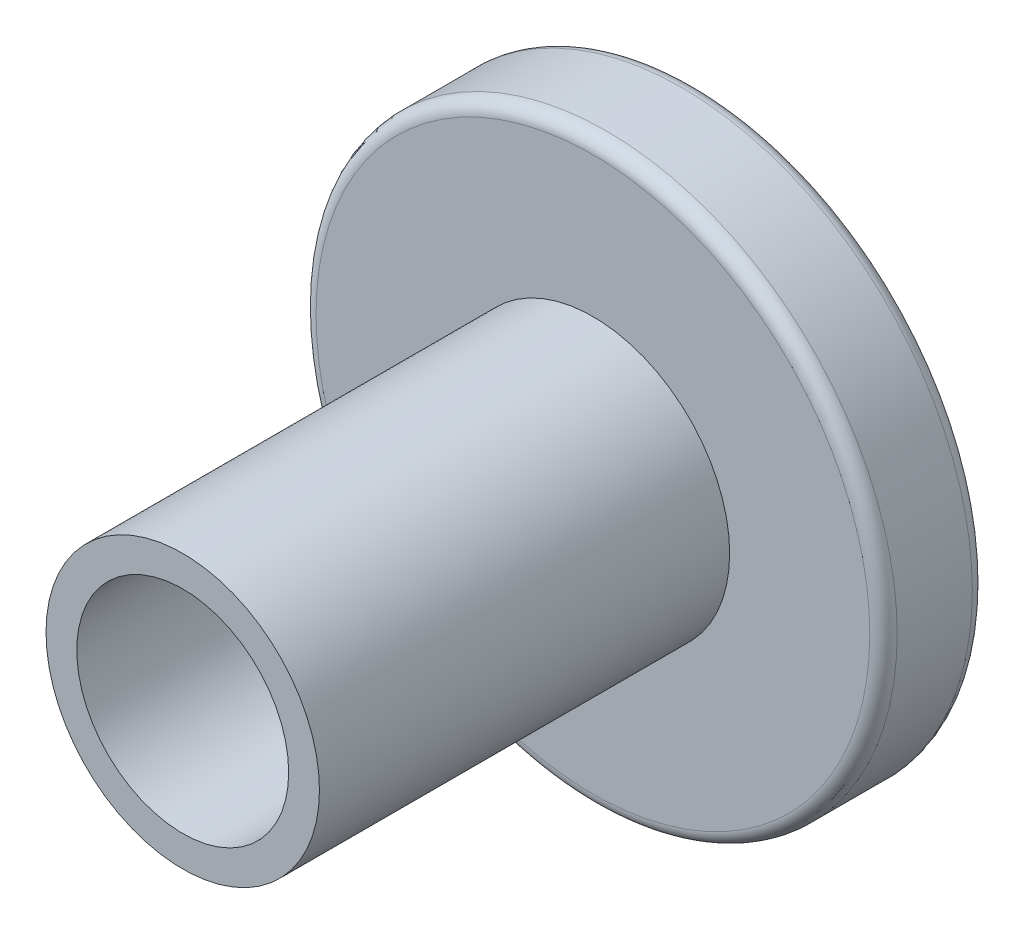
ISO-10303-21;
HEADER;
FILE_DESCRIPTION(('STEP AP214'),'2;1');
FILE_NAME('part.step','',(''),(''),'','','');
FILE_SCHEMA(('AUTOMOTIVE_DESIGN { 1 0 10303 214 1 1 1 1 }'));
ENDSEC;
DATA;
#1=APPLICATION_CONTEXT('core data for automotive mechanical design processes');
#2=APPLICATION_PROTOCOL_DEFINITION('international standard','automotive_design',2000,#1);
#3=PRODUCT_CONTEXT('',#1,'mechanical');
#4=PRODUCT('Part','Part','',(#3));
#5=PRODUCT_RELATED_PRODUCT_CATEGORY('part','',(#4));
#6=PRODUCT_DEFINITION_FORMATION('','',#4);
#7=PRODUCT_DEFINITION_CONTEXT('part definition',#1,'design');
#8=PRODUCT_DEFINITION('design','',#6,#7);
#9=PRODUCT_DEFINITION_SHAPE('','',#8);
#10=(LENGTH_UNIT() NAMED_UNIT(*) SI_UNIT(.MILLI.,.METRE.));
#11=(NAMED_UNIT(*) PLANE_ANGLE_UNIT() SI_UNIT($,.RADIAN.));
#12=(NAMED_UNIT(*) SI_UNIT($,.STERADIAN.) SOLID_ANGLE_UNIT());
#13=UNCERTAINTY_MEASURE_WITH_UNIT(LENGTH_MEASURE(1.E-05),#10,'distance_accuracy_value','');
#14=(GEOMETRIC_REPRESENTATION_CONTEXT(3) GLOBAL_UNCERTAINTY_ASSIGNED_CONTEXT((#13)) GLOBAL_UNIT_ASSIGNED_CONTEXT((#10,
#11,#12)) REPRESENTATION_CONTEXT('',''));
#15=CARTESIAN_POINT('',(0.,0.,0.));
#16=DIRECTION('',(0.,0.,1.));
#17=DIRECTION('',(1.,0.,0.));
#18=AXIS2_PLACEMENT_3D('',#15,#16,#17);
#19=CARTESIAN_POINT('',(0.,0.,1.49999999999975));
#20=DIRECTION('',(0.,0.,1.));
#21=DIRECTION('',(1.,0.,0.));
#22=AXIS2_PLACEMENT_3D('',#19,#20,#21);
#23=PLANE('',#22);
#24=CARTESIAN_POINT('',(0.,0.,1.49999999999975));
#25=DIRECTION('',(0.,0.,1.));
#26=DIRECTION('',(1.,0.,0.));
#27=AXIS2_PLACEMENT_3D('',#24,#25,#26);
#28=CIRCLE('',#27,1.55);
#29=CARTESIAN_POINT('',(1.55000000000002,0.,1.49999999999975));
#30=VERTEX_POINT('',#29);
#31=EDGE_CURVE('E148',#30,#30,#28,.F.);
#32=ORIENTED_EDGE('',*,*,#31,.F.);
#33=EDGE_LOOP('',(#32));
#34=FACE_BOUND('',#33,.T.);
#35=DIRECTION('',(-1.,0.,0.));
#36=VECTOR('',#35,1.);
#37=CARTESIAN_POINT('',(0.721687836487024,-1.24999999999988,1.49999999999975));
#38=LINE('',#37,#36);
#39=CARTESIAN_POINT('',(0.721687836487024,-1.24999999999988,1.49999999999975));
#40=VERTEX_POINT('',#39);
#41=CARTESIAN_POINT('',(-0.721687836486948,-1.24999999999999,1.5));
#42=VERTEX_POINT('',#41);
#43=EDGE_CURVE('E99',#40,#42,#38,.T.);
#44=ORIENTED_EDGE('',*,*,#43,.T.);
#45=DIRECTION('',(-0.499999999999999,0.866025403784435,0.));
#46=VECTOR('',#45,1.);
#47=CARTESIAN_POINT('',(-0.721687836486948,-1.24999999999999,1.5));
#48=LINE('',#47,#46);
#49=CARTESIAN_POINT('',(-1.44337567297416,1.52655665885959E-13,1.4999999999995));
#50=VERTEX_POINT('',#49);
#51=EDGE_CURVE('E93',#42,#50,#48,.T.);
#52=ORIENTED_EDGE('',*,*,#51,.T.);
#53=DIRECTION('',(0.500000000000003,0.866025403784437,0.));
#54=VECTOR('',#53,1.);
#55=CARTESIAN_POINT('',(-1.44337567297416,1.52655665885959E-13,1.4999999999995));
#56=LINE('',#55,#54);
#57=CARTESIAN_POINT('',(-0.721687836487149,1.25000000000024,1.49999999999981));
#58=VERTEX_POINT('',#57);
#59=EDGE_CURVE('E102',#50,#58,#56,.T.);
#60=ORIENTED_EDGE('',*,*,#59,.T.);
#61=DIRECTION('',(1.,0.,0.));
#62=VECTOR('',#61,1.);
#63=CARTESIAN_POINT('',(-0.721687836487149,1.25000000000024,1.49999999999981));
#64=LINE('',#63,#62);
#65=CARTESIAN_POINT('',(0.721687836487087,1.25,1.50000000000006));
#66=VERTEX_POINT('',#65);
#67=EDGE_CURVE('E53',#58,#66,#64,.T.);
#68=ORIENTED_EDGE('',*,*,#67,.T.);
#69=DIRECTION('',(0.499999999999999,-0.866025403784435,0.));
#70=VECTOR('',#69,1.);
#71=CARTESIAN_POINT('',(0.721687836487087,1.25,1.50000000000006));
#72=LINE('',#71,#70);
#73=CARTESIAN_POINT('',(1.44337567297406,0.,1.4999999999995));
#74=VERTEX_POINT('',#73);
#75=EDGE_CURVE('E115',#66,#74,#72,.T.);
#76=ORIENTED_EDGE('',*,*,#75,.T.);
#77=DIRECTION('',(-0.500000000000003,-0.866025403784437,0.));
#78=VECTOR('',#77,1.);
#79=CARTESIAN_POINT('',(1.44337567297406,0.,1.4999999999995));
#80=LINE('',#79,#78);
#81=EDGE_CURVE('E118',#74,#40,#80,.T.);
#82=ORIENTED_EDGE('',*,*,#81,.T.);
#83=EDGE_LOOP('',(#44,#52,#60,#68,#76,#82));
#84=FACE_BOUND('',#83,.T.);
#85=ADVANCED_FACE('F38',(#34,#84),#23,.T.);
#86=CARTESIAN_POINT('',(0.,0.,1.49999999999975));
#87=DIRECTION('',(0.,0.,-1.));
#88=DIRECTION('',(-1.,0.,0.));
#89=AXIS2_PLACEMENT_3D('',#86,#87,#88);
#90=CYLINDRICAL_SURFACE('',#89,4.25);
#91=CARTESIAN_POINT('',(0.,0.,0.199999999999756));
#92=DIRECTION('',(0.,0.,1.));
#93=DIRECTION('',(1.,0.,0.));
#94=AXIS2_PLACEMENT_3D('',#91,#92,#93);
#95=CIRCLE('',#94,4.25);
#96=CARTESIAN_POINT('',(4.24999999999999,0.,0.19999999999975));
#97=VERTEX_POINT('',#96);
#98=EDGE_CURVE('E156',#97,#97,#95,.T.);
#99=ORIENTED_EDGE('',*,*,#98,.T.);
#100=EDGE_LOOP('',(#99));
#101=FACE_BOUND('',#100,.T.);
#102=CARTESIAN_POINT('',(0.,0.,1.2999999999995));
#103=DIRECTION('',(0.,0.,1.));
#104=DIRECTION('',(1.,0.,0.));
#105=AXIS2_PLACEMENT_3D('',#102,#103,#104);
#106=CIRCLE('',#105,4.25);
#107=CARTESIAN_POINT('',(4.25,0.,1.29999999999949));
#108=VERTEX_POINT('',#107);
#109=EDGE_CURVE('E153',#108,#108,#106,.F.);
#110=ORIENTED_EDGE('',*,*,#109,.T.);
#111=EDGE_LOOP('',(#110));
#112=FACE_BOUND('',#111,.T.);
#113=ADVANCED_FACE('F169',(#101,#112),#90,.T.);
#114=CARTESIAN_POINT('',(0.,0.,1.49999999999975));
#115=DIRECTION('',(0.,0.,1.));
#116=DIRECTION('',(1.,0.,0.));
#117=AXIS2_PLACEMENT_3D('',#114,#115,#116);
#118=CIRCLE('',#117,4.05);
#119=CARTESIAN_POINT('',(4.05000000000002,0.,1.49999999999975));
#120=VERTEX_POINT('',#119);
#121=EDGE_CURVE('E11',#120,#120,#118,.T.);
#122=ORIENTED_EDGE('',*,*,#121,.T.);
#123=EDGE_LOOP('',(#122));
#124=FACE_BOUND('',#123,.T.);
#125=CARTESIAN_POINT('',(0.,0.,1.49999999999975));
#126=DIRECTION('',(0.,0.,1.));
#127=DIRECTION('',(1.,0.,0.));
#128=AXIS2_PLACEMENT_3D('',#125,#126,#127);
#129=CIRCLE('',#128,2.);
#130=CARTESIAN_POINT('',(2.00000000000002,0.,1.49999999999975));
#131=VERTEX_POINT('',#130);
#132=EDGE_CURVE('E144',#131,#131,#129,.T.);
#133=ORIENTED_EDGE('',*,*,#132,.F.);
#134=EDGE_LOOP('',(#133));
#135=FACE_BOUND('',#134,.T.);
#136=ADVANCED_FACE('F172',(#124,#135),#23,.T.);
#137=CARTESIAN_POINT('',(0.,0.,0.));
#138=DIRECTION('',(0.,0.,1.));
#139=DIRECTION('',(1.,0.,0.));
#140=AXIS2_PLACEMENT_3D('',#137,#138,#139);
#141=PLANE('',#140);
#142=DIRECTION('',(0.500000000000003,0.866025403784437,0.));
#143=VECTOR('',#142,1.);
#144=CARTESIAN_POINT('',(-1.44337567297412,1.52655665885959E-13,0.));
#145=LINE('',#144,#143);
#146=CARTESIAN_POINT('',(-1.44337567297412,1.52655665885959E-13,0.));
#147=VERTEX_POINT('',#146);
#148=CARTESIAN_POINT('',(-0.721687836487031,1.25000000000013,-1.38777878078145E-13));
#149=VERTEX_POINT('',#148);
#150=EDGE_CURVE('E122',#147,#149,#145,.T.);
#151=ORIENTED_EDGE('',*,*,#150,.F.);
#152=DIRECTION('',(-0.499999999999999,0.866025403784435,0.));
#153=VECTOR('',#152,1.);
#154=CARTESIAN_POINT('',(-0.721687836486885,-1.25000000000007,0.));
#155=LINE('',#154,#153);
#156=CARTESIAN_POINT('',(-0.721687836486885,-1.25000000000007,0.));
#157=VERTEX_POINT('',#156);
#158=EDGE_CURVE('E61',#157,#147,#155,.T.);
#159=ORIENTED_EDGE('',*,*,#158,.F.);
#160=DIRECTION('',(-1.,0.,0.));
#161=VECTOR('',#160,1.);
#162=CARTESIAN_POINT('',(0.721687836487184,-1.24999999999999,-1.94289029309402E-13));
#163=LINE('',#162,#161);
#164=CARTESIAN_POINT('',(0.721687836487184,-1.24999999999999,-1.94289029309402E-13));
#165=VERTEX_POINT('',#164);
#166=EDGE_CURVE('E108',#165,#157,#163,.T.);
#167=ORIENTED_EDGE('',*,*,#166,.F.);
#168=DIRECTION('',(-0.500000000000003,-0.866025403784437,0.));
#169=VECTOR('',#168,1.);
#170=CARTESIAN_POINT('',(1.443375672974,0.,0.));
#171=LINE('',#170,#169);
#172=CARTESIAN_POINT('',(1.443375672974,0.,0.));
#173=VERTEX_POINT('',#172);
#174=EDGE_CURVE('E111',#173,#165,#171,.T.);
#175=ORIENTED_EDGE('',*,*,#174,.F.);
#176=DIRECTION('',(0.499999999999999,-0.866025403784435,0.));
#177=VECTOR('',#176,1.);
#178=CARTESIAN_POINT('',(0.721687836487059,1.24999999999999,0.));
#179=LINE('',#178,#177);
#180=CARTESIAN_POINT('',(0.721687836487059,1.24999999999999,0.));
#181=VERTEX_POINT('',#180);
#182=EDGE_CURVE('E127',#181,#173,#179,.T.);
#183=ORIENTED_EDGE('',*,*,#182,.F.);
#184=DIRECTION('',(1.,0.,0.));
#185=VECTOR('',#184,1.);
#186=CARTESIAN_POINT('',(-0.721687836487031,1.25000000000013,-1.38777878078145E-13));
#187=LINE('',#186,#185);
#188=EDGE_CURVE('E124',#149,#181,#187,.T.);
#189=ORIENTED_EDGE('',*,*,#188,.F.);
#190=EDGE_LOOP('',(#151,#159,#167,#175,#183,#189));
#191=FACE_BOUND('',#190,.T.);
#192=CARTESIAN_POINT('',(0.,0.,0.));
#193=DIRECTION('',(0.,0.,1.));
#194=DIRECTION('',(1.,0.,0.));
#195=AXIS2_PLACEMENT_3D('',#192,#193,#194);
#196=CIRCLE('',#195,4.05);
#197=CARTESIAN_POINT('',(4.05,0.,0.));
#198=VERTEX_POINT('',#197);
#199=EDGE_CURVE('E46',#198,#198,#196,.F.);
#200=ORIENTED_EDGE('',*,*,#199,.T.);
#201=EDGE_LOOP('',(#200));
#202=FACE_BOUND('',#201,.T.);
#203=ADVANCED_FACE('F161',(#191,#202),#141,.F.);
#204=CARTESIAN_POINT('',(1.11022302462516E-13,0.,7.50000000000001));
#205=DIRECTION('',(0.,0.,1.));
#206=DIRECTION('',(1.,0.,0.));
#207=AXIS2_PLACEMENT_3D('',#204,#205,#206);
#208=PLANE('',#207);
#209=CARTESIAN_POINT('',(1.11022302462516E-13,0.,7.50000000000001));
#210=DIRECTION('',(0.,0.,1.));
#211=DIRECTION('',(1.,0.,0.));
#212=AXIS2_PLACEMENT_3D('',#209,#210,#211);
#213=CIRCLE('',#212,2.);
#214=CARTESIAN_POINT('',(2.00000000000011,0.,7.5));
#215=VERTEX_POINT('',#214);
#216=EDGE_CURVE('E145',#215,#215,#213,.T.);
#217=ORIENTED_EDGE('',*,*,#216,.T.);
#218=EDGE_LOOP('',(#217));
#219=FACE_BOUND('',#218,.T.);
#220=CARTESIAN_POINT('',(1.11022302462516E-13,0.,7.50000000000001));
#221=DIRECTION('',(0.,0.,1.));
#222=DIRECTION('',(1.,0.,0.));
#223=AXIS2_PLACEMENT_3D('',#220,#221,#222);
#224=CIRCLE('',#223,1.55);
#225=CARTESIAN_POINT('',(1.55000000000011,0.,7.50000000000001));
#226=VERTEX_POINT('',#225);
#227=EDGE_CURVE('E134',#226,#226,#224,.T.);
#228=ORIENTED_EDGE('',*,*,#227,.F.);
#229=EDGE_LOOP('',(#228));
#230=FACE_BOUND('',#229,.T.);
#231=ADVANCED_FACE('F187',(#219,#230),#208,.T.);
#232=CARTESIAN_POINT('',(1.11022302462516E-13,0.,7.50000000000001));
#233=DIRECTION('',(0.,0.,-1.));
#234=DIRECTION('',(-1.,0.,0.));
#235=AXIS2_PLACEMENT_3D('',#232,#233,#234);
#236=CYLINDRICAL_SURFACE('',#235,2.);
#237=ORIENTED_EDGE('',*,*,#216,.F.);
#238=EDGE_LOOP('',(#237));
#239=FACE_BOUND('',#238,.T.);
#240=ORIENTED_EDGE('',*,*,#132,.T.);
#241=EDGE_LOOP('',(#240));
#242=FACE_BOUND('',#241,.T.);
#243=ADVANCED_FACE('F185',(#239,#242),#236,.T.);
#244=CARTESIAN_POINT('',(1.11022302462516E-13,0.,7.50000000000001));
#245=DIRECTION('',(0.,0.,-1.));
#246=DIRECTION('',(-1.,0.,0.));
#247=AXIS2_PLACEMENT_3D('',#244,#245,#246);
#248=CYLINDRICAL_SURFACE('',#247,1.55);
#249=ORIENTED_EDGE('',*,*,#227,.T.);
#250=EDGE_LOOP('',(#249));
#251=FACE_BOUND('',#250,.T.);
#252=ORIENTED_EDGE('',*,*,#31,.T.);
#253=EDGE_LOOP('',(#252));
#254=FACE_BOUND('',#253,.T.);
#255=ADVANCED_FACE('F166',(#251,#254),#248,.F.);
#256=CARTESIAN_POINT('',(0.,0.,0.199999999999756));
#257=DIRECTION('',(0.,0.,1.));
#258=DIRECTION('',(1.,0.,0.));
#259=AXIS2_PLACEMENT_3D('',#256,#257,#258);
#260=TOROIDAL_SURFACE('',#259,4.05,0.2);
#261=ORIENTED_EDGE('',*,*,#199,.F.);
#262=EDGE_LOOP('',(#261));
#263=FACE_BOUND('',#262,.T.);
#264=ORIENTED_EDGE('',*,*,#98,.F.);
#265=EDGE_LOOP('',(#264));
#266=FACE_BOUND('',#265,.T.);
#267=ADVANCED_FACE('F163',(#263,#266),#260,.T.);
#268=CARTESIAN_POINT('',(0.,0.,1.2999999999995));
#269=DIRECTION('',(0.,0.,1.));
#270=DIRECTION('',(1.,0.,0.));
#271=AXIS2_PLACEMENT_3D('',#268,#269,#270);
#272=TOROIDAL_SURFACE('',#271,4.05,0.2);
#273=ORIENTED_EDGE('',*,*,#109,.F.);
#274=EDGE_LOOP('',(#273));
#275=FACE_BOUND('',#274,.T.);
#276=ORIENTED_EDGE('',*,*,#121,.F.);
#277=EDGE_LOOP('',(#276));
#278=FACE_BOUND('',#277,.T.);
#279=ADVANCED_FACE('F40',(#275,#278),#272,.T.);
#280=CARTESIAN_POINT('',(-0.721687836486948,-1.24999999999999,1.5));
#281=DIRECTION('',(-0.866025403784439,-0.500000000000003,0.));
#282=DIRECTION('',(0.499999999999999,-0.866025403784435,0.));
#283=AXIS2_PLACEMENT_3D('',#280,#281,#282);
#284=PLANE('',#283);
#285=ORIENTED_EDGE('',*,*,#158,.T.);
#286=DIRECTION('',(0.,0.,-1.));
#287=VECTOR('',#286,1.);
#288=CARTESIAN_POINT('',(-1.44337567297416,1.52655665885959E-13,1.4999999999995));
#289=LINE('',#288,#287);
#290=EDGE_CURVE('E89',#50,#147,#289,.T.);
#291=ORIENTED_EDGE('',*,*,#290,.F.);
#292=ORIENTED_EDGE('',*,*,#51,.F.);
#293=DIRECTION('',(0.,0.,-1.));
#294=VECTOR('',#293,1.);
#295=CARTESIAN_POINT('',(-0.721687836486948,-1.24999999999999,1.5));
#296=LINE('',#295,#294);
#297=EDGE_CURVE('E132',#42,#157,#296,.T.);
#298=ORIENTED_EDGE('',*,*,#297,.T.);
#299=EDGE_LOOP('',(#285,#291,#292,#298));
#300=FACE_BOUND('',#299,.T.);
#301=ADVANCED_FACE('F91',(#300),#284,.F.);
#302=CARTESIAN_POINT('',(0.721687836487024,-1.24999999999988,1.49999999999975));
#303=DIRECTION('',(0.,-0.999999999999997,0.));
#304=DIRECTION('',(0.,0.,-1.));
#305=AXIS2_PLACEMENT_3D('',#302,#303,#304);
#306=PLANE('',#305);
#307=ORIENTED_EDGE('',*,*,#166,.T.);
#308=ORIENTED_EDGE('',*,*,#297,.F.);
#309=ORIENTED_EDGE('',*,*,#43,.F.);
#310=DIRECTION('',(0.,0.,-1.));
#311=VECTOR('',#310,1.);
#312=CARTESIAN_POINT('',(0.721687836487024,-1.24999999999988,1.49999999999975));
#313=LINE('',#312,#311);
#314=EDGE_CURVE('E135',#40,#165,#313,.T.);
#315=ORIENTED_EDGE('',*,*,#314,.T.);
#316=EDGE_LOOP('',(#307,#308,#309,#315));
#317=FACE_BOUND('',#316,.T.);
#318=ADVANCED_FACE('F221',(#317),#306,.F.);
#319=CARTESIAN_POINT('',(1.44337567297406,0.,1.4999999999995));
#320=DIRECTION('',(0.866025403784438,-0.499999999999997,0.));
#321=DIRECTION('',(0.500000000000003,0.866025403784437,0.));
#322=AXIS2_PLACEMENT_3D('',#319,#320,#321);
#323=PLANE('',#322);
#324=ORIENTED_EDGE('',*,*,#174,.T.);
#325=ORIENTED_EDGE('',*,*,#314,.F.);
#326=ORIENTED_EDGE('',*,*,#81,.F.);
#327=DIRECTION('',(0.,0.,-1.));
#328=VECTOR('',#327,1.);
#329=CARTESIAN_POINT('',(1.44337567297406,0.,1.4999999999995));
#330=LINE('',#329,#328);
#331=EDGE_CURVE('E137',#74,#173,#330,.T.);
#332=ORIENTED_EDGE('',*,*,#331,.T.);
#333=EDGE_LOOP('',(#324,#325,#326,#332));
#334=FACE_BOUND('',#333,.T.);
#335=ADVANCED_FACE('F219',(#334),#323,.F.);
#336=CARTESIAN_POINT('',(0.721687836487087,1.25,1.50000000000006));
#337=DIRECTION('',(0.866025403784439,0.500000000000002,0.));
#338=DIRECTION('',(-0.499999999999999,0.866025403784435,0.));
#339=AXIS2_PLACEMENT_3D('',#336,#337,#338);
#340=PLANE('',#339);
#341=ORIENTED_EDGE('',*,*,#182,.T.);
#342=ORIENTED_EDGE('',*,*,#331,.F.);
#343=ORIENTED_EDGE('',*,*,#75,.F.);
#344=DIRECTION('',(0.,0.,-1.));
#345=VECTOR('',#344,1.);
#346=CARTESIAN_POINT('',(0.721687836487087,1.25,1.50000000000006));
#347=LINE('',#346,#345);
#348=EDGE_CURVE('E139',#66,#181,#347,.T.);
#349=ORIENTED_EDGE('',*,*,#348,.T.);
#350=EDGE_LOOP('',(#341,#342,#343,#349));
#351=FACE_BOUND('',#350,.T.);
#352=ADVANCED_FACE('F216',(#351),#340,.F.);
#353=CARTESIAN_POINT('',(-0.721687836487149,1.25000000000024,1.49999999999981));
#354=DIRECTION('',(0.,0.999999999999997,0.));
#355=DIRECTION('',(0.,0.,1.));
#356=AXIS2_PLACEMENT_3D('',#353,#354,#355);
#357=PLANE('',#356);
#358=ORIENTED_EDGE('',*,*,#188,.T.);
#359=ORIENTED_EDGE('',*,*,#348,.F.);
#360=ORIENTED_EDGE('',*,*,#67,.F.);
#361=DIRECTION('',(0.,0.,-1.));
#362=VECTOR('',#361,1.);
#363=CARTESIAN_POINT('',(-0.721687836487149,1.25000000000024,1.49999999999981));
#364=LINE('',#363,#362);
#365=EDGE_CURVE('E98',#58,#149,#364,.T.);
#366=ORIENTED_EDGE('',*,*,#365,.T.);
#367=EDGE_LOOP('',(#358,#359,#360,#366));
#368=FACE_BOUND('',#367,.T.);
#369=ADVANCED_FACE('F213',(#368),#357,.F.);
#370=CARTESIAN_POINT('',(-1.44337567297416,1.52655665885959E-13,1.4999999999995));
#371=DIRECTION('',(-0.866025403784439,0.499999999999997,0.));
#372=DIRECTION('',(-0.500000000000003,-0.866025403784437,0.));
#373=AXIS2_PLACEMENT_3D('',#370,#371,#372);
#374=PLANE('',#373);
#375=ORIENTED_EDGE('',*,*,#150,.T.);
#376=ORIENTED_EDGE('',*,*,#365,.F.);
#377=ORIENTED_EDGE('',*,*,#59,.F.);
#378=ORIENTED_EDGE('',*,*,#290,.T.);
#379=EDGE_LOOP('',(#375,#376,#377,#378));
#380=FACE_BOUND('',#379,.T.);
#381=ADVANCED_FACE('F103',(#380),#374,.F.);
#382=CLOSED_SHELL('',(#85,#113,#136,#203,#231,#243,#255,#267,#279,#301,#318,#335,#352,#369,#381));
#383=MANIFOLD_SOLID_BREP('B2',#382);
#384=ADVANCED_BREP_SHAPE_REPRESENTATION('',(#18,#383),#14);
#385=SHAPE_DEFINITION_REPRESENTATION(#9,#384);
ENDSEC;
END-ISO-10303-21;
